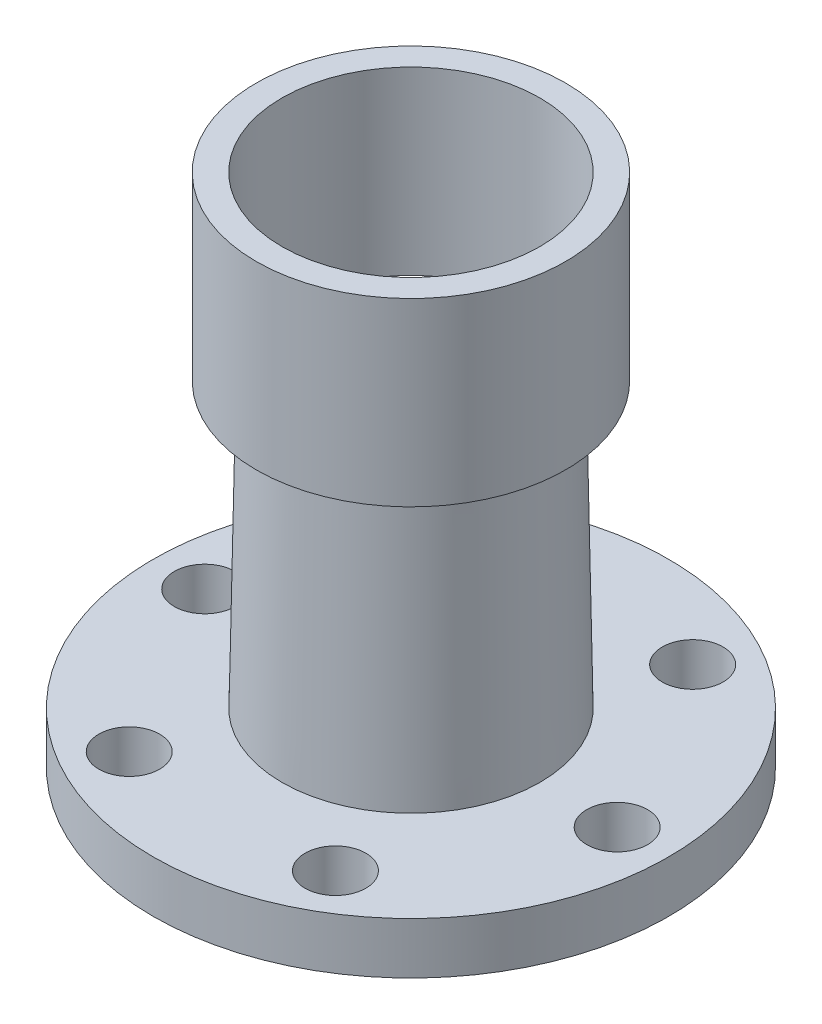
ISO-10303-21;
HEADER;
FILE_DESCRIPTION(('STEP AP214'),'2;1');
FILE_NAME('part.step','',(''),(''),'','','');
FILE_SCHEMA(('AUTOMOTIVE_DESIGN { 1 0 10303 214 1 1 1 1 }'));
ENDSEC;
DATA;
#1=APPLICATION_CONTEXT('core data for automotive mechanical design processes');
#2=APPLICATION_PROTOCOL_DEFINITION('international standard','automotive_design',2000,#1);
#3=PRODUCT_CONTEXT('',#1,'mechanical');
#4=PRODUCT('Part','Part','',(#3));
#5=PRODUCT_RELATED_PRODUCT_CATEGORY('part','',(#4));
#6=PRODUCT_DEFINITION_FORMATION('','',#4);
#7=PRODUCT_DEFINITION_CONTEXT('part definition',#1,'design');
#8=PRODUCT_DEFINITION('design','',#6,#7);
#9=PRODUCT_DEFINITION_SHAPE('','',#8);
#10=(LENGTH_UNIT() NAMED_UNIT(*) SI_UNIT(.MILLI.,.METRE.));
#11=(NAMED_UNIT(*) PLANE_ANGLE_UNIT() SI_UNIT($,.RADIAN.));
#12=(NAMED_UNIT(*) SI_UNIT($,.STERADIAN.) SOLID_ANGLE_UNIT());
#13=UNCERTAINTY_MEASURE_WITH_UNIT(LENGTH_MEASURE(1.E-05),#10,'distance_accuracy_value','');
#14=(GEOMETRIC_REPRESENTATION_CONTEXT(3) GLOBAL_UNCERTAINTY_ASSIGNED_CONTEXT((#13)) GLOBAL_UNIT_ASSIGNED_CONTEXT((#10,
#11,#12)) REPRESENTATION_CONTEXT('',''));
#15=CARTESIAN_POINT('',(0.,0.,0.));
#16=DIRECTION('',(0.,0.,1.));
#17=DIRECTION('',(1.,0.,0.));
#18=AXIS2_PLACEMENT_3D('',#15,#16,#17);
#19=CARTESIAN_POINT('',(0.,95.,0.));
#20=DIRECTION('',(0.,1.,0.));
#21=DIRECTION('',(0.,0.,1.));
#22=AXIS2_PLACEMENT_3D('',#19,#20,#21);
#23=PLANE('',#22);
#24=CARTESIAN_POINT('',(0.,95.,0.));
#25=DIRECTION('',(0.,1.,0.));
#26=DIRECTION('',(0.,0.,1.));
#27=AXIS2_PLACEMENT_3D('',#24,#25,#26);
#28=CIRCLE('',#27,30.);
#29=CARTESIAN_POINT('',(0.,95.,30.));
#30=VERTEX_POINT('',#29);
#31=EDGE_CURVE('E11',#30,#30,#28,.T.);
#32=ORIENTED_EDGE('',*,*,#31,.T.);
#33=EDGE_LOOP('',(#32));
#34=FACE_BOUND('',#33,.T.);
#35=CARTESIAN_POINT('',(0.,95.,0.));
#36=DIRECTION('',(0.,1.,0.));
#37=DIRECTION('',(0.,0.,1.));
#38=AXIS2_PLACEMENT_3D('',#35,#36,#37);
#39=CIRCLE('',#38,25.);
#40=CARTESIAN_POINT('',(0.,95.,25.));
#41=VERTEX_POINT('',#40);
#42=EDGE_CURVE('E62',#41,#41,#39,.T.);
#43=ORIENTED_EDGE('',*,*,#42,.F.);
#44=EDGE_LOOP('',(#43));
#45=FACE_BOUND('',#44,.T.);
#46=ADVANCED_FACE('F51',(#34,#45),#23,.T.);
#47=CARTESIAN_POINT('',(0.,60.,0.));
#48=DIRECTION('',(0.,1.,0.));
#49=DIRECTION('',(0.,0.,1.));
#50=AXIS2_PLACEMENT_3D('',#47,#48,#49);
#51=PLANE('',#50);
#52=CARTESIAN_POINT('',(0.,60.,0.));
#53=DIRECTION('',(0.,1.,0.));
#54=DIRECTION('',(0.,0.,1.));
#55=AXIS2_PLACEMENT_3D('',#52,#53,#54);
#56=CIRCLE('',#55,30.);
#57=CARTESIAN_POINT('',(0.,60.,30.));
#58=VERTEX_POINT('',#57);
#59=EDGE_CURVE('E55',#58,#58,#56,.T.);
#60=ORIENTED_EDGE('',*,*,#59,.F.);
#61=EDGE_LOOP('',(#60));
#62=FACE_BOUND('',#61,.T.);
#63=CARTESIAN_POINT('',(0.,60.,0.));
#64=DIRECTION('',(0.,1.,0.));
#65=DIRECTION('',(0.,0.,1.));
#66=AXIS2_PLACEMENT_3D('',#63,#64,#65);
#67=CIRCLE('',#66,25.);
#68=CARTESIAN_POINT('',(0.,60.,25.));
#69=VERTEX_POINT('',#68);
#70=EDGE_CURVE('E64',#69,#69,#67,.T.);
#71=ORIENTED_EDGE('',*,*,#70,.T.);
#72=EDGE_LOOP('',(#71));
#73=FACE_BOUND('',#72,.T.);
#74=ADVANCED_FACE('F74',(#62,#73),#51,.F.);
#75=CARTESIAN_POINT('',(0.,95.,0.));
#76=DIRECTION('',(0.,-1.,0.));
#77=DIRECTION('',(0.,0.,-1.));
#78=AXIS2_PLACEMENT_3D('',#75,#76,#77);
#79=CYLINDRICAL_SURFACE('',#78,30.);
#80=ORIENTED_EDGE('',*,*,#31,.F.);
#81=EDGE_LOOP('',(#80));
#82=FACE_BOUND('',#81,.T.);
#83=ORIENTED_EDGE('',*,*,#59,.T.);
#84=EDGE_LOOP('',(#83));
#85=FACE_BOUND('',#84,.T.);
#86=ADVANCED_FACE('F53',(#82,#85),#79,.T.);
#87=CARTESIAN_POINT('',(0.,95.,0.));
#88=DIRECTION('',(0.,-1.,0.));
#89=DIRECTION('',(0.,0.,-1.));
#90=AXIS2_PLACEMENT_3D('',#87,#88,#89);
#91=CYLINDRICAL_SURFACE('',#90,25.);
#92=ORIENTED_EDGE('',*,*,#42,.T.);
#93=EDGE_LOOP('',(#92));
#94=FACE_BOUND('',#93,.T.);
#95=ORIENTED_EDGE('',*,*,#70,.F.);
#96=EDGE_LOOP('',(#95));
#97=FACE_BOUND('',#96,.T.);
#98=ADVANCED_FACE('F70',(#94,#97),#91,.F.);
#99=CLOSED_SHELL('',(#46,#74,#86,#98));
#100=MANIFOLD_SOLID_BREP('B2',#99);
#101=CARTESIAN_POINT('',(0.,5.,0.));
#102=DIRECTION('',(0.,-1.,0.));
#103=DIRECTION('',(0.,0.,-1.));
#104=AXIS2_PLACEMENT_3D('',#101,#102,#103);
#105=CYLINDRICAL_SURFACE('',#104,50.);
#106=CARTESIAN_POINT('',(0.,5.,0.));
#107=DIRECTION('',(0.,1.,0.));
#108=DIRECTION('',(0.,0.,1.));
#109=AXIS2_PLACEMENT_3D('',#106,#107,#108);
#110=CIRCLE('',#109,50.);
#111=CARTESIAN_POINT('',(0.,5.,50.));
#112=VERTEX_POINT('',#111);
#113=EDGE_CURVE('E120',#112,#112,#110,.T.);
#114=ORIENTED_EDGE('',*,*,#113,.F.);
#115=EDGE_LOOP('',(#114));
#116=FACE_BOUND('',#115,.T.);
#117=CARTESIAN_POINT('',(0.,-5.,0.));
#118=DIRECTION('',(0.,1.,0.));
#119=DIRECTION('',(0.,0.,1.));
#120=AXIS2_PLACEMENT_3D('',#117,#118,#119);
#121=CIRCLE('',#120,50.);
#122=CARTESIAN_POINT('',(0.,-5.,50.));
#123=VERTEX_POINT('',#122);
#124=EDGE_CURVE('E125',#123,#123,#121,.T.);
#125=ORIENTED_EDGE('',*,*,#124,.T.);
#126=EDGE_LOOP('',(#125));
#127=FACE_BOUND('',#126,.T.);
#128=ADVANCED_FACE('F113',(#116,#127),#105,.T.);
#129=CARTESIAN_POINT('',(0.,5.,0.));
#130=DIRECTION('',(0.,1.,0.));
#131=DIRECTION('',(0.,0.,1.));
#132=AXIS2_PLACEMENT_3D('',#129,#130,#131);
#133=PLANE('',#132);
#134=CARTESIAN_POINT('',(20.0000000000004,5.,34.6410161513773));
#135=DIRECTION('',(0.,1.,0.));
#136=DIRECTION('',(0.,0.,1.));
#137=AXIS2_PLACEMENT_3D('',#134,#135,#136);
#138=CIRCLE('',#137,5.90000000000001);
#139=CARTESIAN_POINT('',(20.0000000000004,5.,40.5410161513773));
#140=VERTEX_POINT('',#139);
#141=EDGE_CURVE('E188',#140,#140,#138,.T.);
#142=ORIENTED_EDGE('',*,*,#141,.F.);
#143=EDGE_LOOP('',(#142));
#144=FACE_BOUND('',#143,.T.);
#145=CARTESIAN_POINT('',(-19.9999999999997,5.,34.6410161513777));
#146=DIRECTION('',(0.,1.,0.));
#147=DIRECTION('',(0.,0.,1.));
#148=AXIS2_PLACEMENT_3D('',#145,#146,#147);
#149=CIRCLE('',#148,5.90000000000001);
#150=CARTESIAN_POINT('',(-19.9999999999997,5.,40.5410161513777));
#151=VERTEX_POINT('',#150);
#152=EDGE_CURVE('E180',#151,#151,#149,.T.);
#153=ORIENTED_EDGE('',*,*,#152,.F.);
#154=EDGE_LOOP('',(#153));
#155=FACE_BOUND('',#154,.T.);
#156=CARTESIAN_POINT('',(-40.,5.,0.));
#157=DIRECTION('',(0.,1.,0.));
#158=DIRECTION('',(0.,0.,1.));
#159=AXIS2_PLACEMENT_3D('',#156,#157,#158);
#160=CIRCLE('',#159,5.90000000000002);
#161=CARTESIAN_POINT('',(-40.,5.,5.90000000000002));
#162=VERTEX_POINT('',#161);
#163=EDGE_CURVE('E172',#162,#162,#160,.T.);
#164=ORIENTED_EDGE('',*,*,#163,.F.);
#165=EDGE_LOOP('',(#164));
#166=FACE_BOUND('',#165,.T.);
#167=CARTESIAN_POINT('',(-20.0000000000002,5.,-34.6410161513775));
#168=DIRECTION('',(0.,1.,0.));
#169=DIRECTION('',(0.,0.,1.));
#170=AXIS2_PLACEMENT_3D('',#167,#168,#169);
#171=CIRCLE('',#170,5.90000000000001);
#172=CARTESIAN_POINT('',(-20.0000000000002,5.,-28.7410161513775));
#173=VERTEX_POINT('',#172);
#174=EDGE_CURVE('E164',#173,#173,#171,.T.);
#175=ORIENTED_EDGE('',*,*,#174,.F.);
#176=EDGE_LOOP('',(#175));
#177=FACE_BOUND('',#176,.T.);
#178=CARTESIAN_POINT('',(19.9999999999999,5.,-34.6410161513776));
#179=DIRECTION('',(0.,1.,0.));
#180=DIRECTION('',(0.,0.,1.));
#181=AXIS2_PLACEMENT_3D('',#178,#179,#180);
#182=CIRCLE('',#181,5.90000000000001);
#183=CARTESIAN_POINT('',(19.9999999999999,5.,-28.7410161513776));
#184=VERTEX_POINT('',#183);
#185=EDGE_CURVE('E156',#184,#184,#182,.T.);
#186=ORIENTED_EDGE('',*,*,#185,.F.);
#187=EDGE_LOOP('',(#186));
#188=FACE_BOUND('',#187,.T.);
#189=CARTESIAN_POINT('',(40.,5.,0.));
#190=DIRECTION('',(0.,1.,0.));
#191=DIRECTION('',(0.,0.,1.));
#192=AXIS2_PLACEMENT_3D('',#189,#190,#191);
#193=CIRCLE('',#192,5.90000000000002);
#194=CARTESIAN_POINT('',(40.,5.,5.90000000000002));
#195=VERTEX_POINT('',#194);
#196=EDGE_CURVE('E148',#195,#195,#193,.T.);
#197=ORIENTED_EDGE('',*,*,#196,.F.);
#198=EDGE_LOOP('',(#197));
#199=FACE_BOUND('',#198,.T.);
#200=CARTESIAN_POINT('',(0.,5.,0.));
#201=DIRECTION('',(0.,1.,0.));
#202=DIRECTION('',(0.,0.,1.));
#203=AXIS2_PLACEMENT_3D('',#200,#201,#202);
#204=CIRCLE('',#203,25.);
#205=CARTESIAN_POINT('',(0.,5.,25.));
#206=VERTEX_POINT('',#205);
#207=EDGE_CURVE('E137',#206,#206,#204,.T.);
#208=ORIENTED_EDGE('',*,*,#207,.F.);
#209=EDGE_LOOP('',(#208));
#210=FACE_BOUND('',#209,.T.);
#211=ORIENTED_EDGE('',*,*,#113,.T.);
#212=EDGE_LOOP('',(#211));
#213=FACE_BOUND('',#212,.T.);
#214=ADVANCED_FACE('F195',(#144,#155,#166,#177,#188,#199,#210,#213),#133,.T.);
#215=CARTESIAN_POINT('',(0.,-5.,0.));
#216=DIRECTION('',(0.,1.,0.));
#217=DIRECTION('',(0.,0.,1.));
#218=AXIS2_PLACEMENT_3D('',#215,#216,#217);
#219=PLANE('',#218);
#220=CARTESIAN_POINT('',(20.0000000000004,-5.,34.6410161513773));
#221=DIRECTION('',(0.,1.,0.));
#222=DIRECTION('',(0.,0.,1.));
#223=AXIS2_PLACEMENT_3D('',#220,#221,#222);
#224=CIRCLE('',#223,5.90000000000001);
#225=CARTESIAN_POINT('',(20.0000000000004,-5.,40.5410161513773));
#226=VERTEX_POINT('',#225);
#227=EDGE_CURVE('E184',#226,#226,#224,.T.);
#228=ORIENTED_EDGE('',*,*,#227,.T.);
#229=EDGE_LOOP('',(#228));
#230=FACE_BOUND('',#229,.T.);
#231=CARTESIAN_POINT('',(-19.9999999999997,-5.,34.6410161513777));
#232=DIRECTION('',(0.,1.,0.));
#233=DIRECTION('',(0.,0.,1.));
#234=AXIS2_PLACEMENT_3D('',#231,#232,#233);
#235=CIRCLE('',#234,5.90000000000001);
#236=CARTESIAN_POINT('',(-19.9999999999997,-5.,40.5410161513777));
#237=VERTEX_POINT('',#236);
#238=EDGE_CURVE('E176',#237,#237,#235,.T.);
#239=ORIENTED_EDGE('',*,*,#238,.T.);
#240=EDGE_LOOP('',(#239));
#241=FACE_BOUND('',#240,.T.);
#242=CARTESIAN_POINT('',(-40.,-5.,0.));
#243=DIRECTION('',(0.,1.,0.));
#244=DIRECTION('',(0.,0.,1.));
#245=AXIS2_PLACEMENT_3D('',#242,#243,#244);
#246=CIRCLE('',#245,5.90000000000001);
#247=CARTESIAN_POINT('',(-40.,-5.,5.90000000000001));
#248=VERTEX_POINT('',#247);
#249=EDGE_CURVE('E168',#248,#248,#246,.T.);
#250=ORIENTED_EDGE('',*,*,#249,.T.);
#251=EDGE_LOOP('',(#250));
#252=FACE_BOUND('',#251,.T.);
#253=CARTESIAN_POINT('',(-20.0000000000002,-5.,-34.6410161513775));
#254=DIRECTION('',(0.,1.,0.));
#255=DIRECTION('',(0.,0.,1.));
#256=AXIS2_PLACEMENT_3D('',#253,#254,#255);
#257=CIRCLE('',#256,5.90000000000001);
#258=CARTESIAN_POINT('',(-20.0000000000002,-5.,-28.7410161513775));
#259=VERTEX_POINT('',#258);
#260=EDGE_CURVE('E160',#259,#259,#257,.T.);
#261=ORIENTED_EDGE('',*,*,#260,.T.);
#262=EDGE_LOOP('',(#261));
#263=FACE_BOUND('',#262,.T.);
#264=CARTESIAN_POINT('',(19.9999999999999,-5.,-34.6410161513776));
#265=DIRECTION('',(0.,1.,0.));
#266=DIRECTION('',(0.,0.,1.));
#267=AXIS2_PLACEMENT_3D('',#264,#265,#266);
#268=CIRCLE('',#267,5.90000000000001);
#269=CARTESIAN_POINT('',(19.9999999999999,-5.,-28.7410161513776));
#270=VERTEX_POINT('',#269);
#271=EDGE_CURVE('E152',#270,#270,#268,.T.);
#272=ORIENTED_EDGE('',*,*,#271,.T.);
#273=EDGE_LOOP('',(#272));
#274=FACE_BOUND('',#273,.T.);
#275=CARTESIAN_POINT('',(40.,-5.,0.));
#276=DIRECTION('',(0.,1.,0.));
#277=DIRECTION('',(0.,0.,1.));
#278=AXIS2_PLACEMENT_3D('',#275,#276,#277);
#279=CIRCLE('',#278,5.90000000000001);
#280=CARTESIAN_POINT('',(40.,-5.,5.90000000000001));
#281=VERTEX_POINT('',#280);
#282=EDGE_CURVE('E138',#281,#281,#279,.T.);
#283=ORIENTED_EDGE('',*,*,#282,.T.);
#284=EDGE_LOOP('',(#283));
#285=FACE_BOUND('',#284,.T.);
#286=ORIENTED_EDGE('',*,*,#124,.F.);
#287=EDGE_LOOP('',(#286));
#288=FACE_BOUND('',#287,.T.);
#289=ADVANCED_FACE('F198',(#230,#241,#252,#263,#274,#285,#288),#219,.F.);
#290=CARTESIAN_POINT('',(0.,60.,0.));
#291=DIRECTION('',(0.,1.,0.));
#292=DIRECTION('',(0.,0.,1.));
#293=AXIS2_PLACEMENT_3D('',#290,#291,#292);
#294=PLANE('',#293);
#295=CARTESIAN_POINT('',(0.,60.,0.));
#296=DIRECTION('',(0.,1.,0.));
#297=DIRECTION('',(0.,0.,1.));
#298=AXIS2_PLACEMENT_3D('',#295,#296,#297);
#299=CIRCLE('',#298,24.039971428948);
#300=CARTESIAN_POINT('',(0.,60.,24.039971428948));
#301=VERTEX_POINT('',#300);
#302=EDGE_CURVE('E131',#301,#301,#299,.T.);
#303=ORIENTED_EDGE('',*,*,#302,.T.);
#304=EDGE_LOOP('',(#303));
#305=FACE_BOUND('',#304,.T.);
#306=CARTESIAN_POINT('',(0.,60.,0.));
#307=DIRECTION('',(0.,1.,0.));
#308=DIRECTION('',(0.,0.,1.));
#309=AXIS2_PLACEMENT_3D('',#306,#307,#308);
#310=CIRCLE('',#309,20.960028571052);
#311=CARTESIAN_POINT('',(0.,60.,20.960028571052));
#312=VERTEX_POINT('',#311);
#313=EDGE_CURVE('E133',#312,#312,#310,.T.);
#314=ORIENTED_EDGE('',*,*,#313,.F.);
#315=EDGE_LOOP('',(#314));
#316=FACE_BOUND('',#315,.T.);
#317=ADVANCED_FACE('F216',(#305,#316),#294,.T.);
#318=CARTESIAN_POINT('',(0.,5.,0.));
#319=DIRECTION('',(0.,-1.,0.));
#320=DIRECTION('',(0.,0.,1.));
#321=AXIS2_PLACEMENT_3D('',#318,#319,#320);
#322=CONICAL_SURFACE('',#321,25.,0.0174532925199433);
#323=ORIENTED_EDGE('',*,*,#302,.F.);
#324=EDGE_LOOP('',(#323));
#325=FACE_BOUND('',#324,.T.);
#326=ORIENTED_EDGE('',*,*,#207,.T.);
#327=EDGE_LOOP('',(#326));
#328=FACE_BOUND('',#327,.T.);
#329=ADVANCED_FACE('F213',(#325,#328),#322,.T.);
#330=CARTESIAN_POINT('',(0.,5.,0.));
#331=DIRECTION('',(0.,1.,0.));
#332=DIRECTION('',(0.,0.,1.));
#333=AXIS2_PLACEMENT_3D('',#330,#331,#332);
#334=CONICAL_SURFACE('',#333,20.,0.0174532925199433);
#335=ORIENTED_EDGE('',*,*,#313,.T.);
#336=EDGE_LOOP('',(#335));
#337=FACE_BOUND('',#336,.T.);
#338=CARTESIAN_POINT('',(0.,5.,0.));
#339=DIRECTION('',(0.,1.,0.));
#340=DIRECTION('',(0.,0.,1.));
#341=AXIS2_PLACEMENT_3D('',#338,#339,#340);
#342=CIRCLE('',#341,20.);
#343=CARTESIAN_POINT('',(0.,5.,20.));
#344=VERTEX_POINT('',#343);
#345=EDGE_CURVE('E50',#344,#344,#342,.F.);
#346=ORIENTED_EDGE('',*,*,#345,.T.);
#347=EDGE_LOOP('',(#346));
#348=FACE_BOUND('',#347,.T.);
#349=ADVANCED_FACE('F215',(#337,#348),#334,.F.);
#350=ORIENTED_EDGE('',*,*,#345,.F.);
#351=EDGE_LOOP('',(#350));
#352=FACE_BOUND('',#351,.T.);
#353=ADVANCED_FACE('F200',(#352),#133,.T.);
#354=CARTESIAN_POINT('',(40.,5.,0.));
#355=DIRECTION('',(0.,1.,0.));
#356=DIRECTION('',(0.,0.,1.));
#357=AXIS2_PLACEMENT_3D('',#354,#355,#356);
#358=CYLINDRICAL_SURFACE('',#357,5.90000000000001);
#359=ORIENTED_EDGE('',*,*,#282,.F.);
#360=EDGE_LOOP('',(#359));
#361=FACE_BOUND('',#360,.T.);
#362=ORIENTED_EDGE('',*,*,#196,.T.);
#363=EDGE_LOOP('',(#362));
#364=FACE_BOUND('',#363,.T.);
#365=ADVANCED_FACE('F252',(#361,#364),#358,.F.);
#366=CARTESIAN_POINT('',(19.9999999999999,5.,-34.6410161513776));
#367=DIRECTION('',(0.,1.,0.));
#368=DIRECTION('',(0.,0.,1.));
#369=AXIS2_PLACEMENT_3D('',#366,#367,#368);
#370=CYLINDRICAL_SURFACE('',#369,5.90000000000001);
#371=ORIENTED_EDGE('',*,*,#271,.F.);
#372=EDGE_LOOP('',(#371));
#373=FACE_BOUND('',#372,.T.);
#374=ORIENTED_EDGE('',*,*,#185,.T.);
#375=EDGE_LOOP('',(#374));
#376=FACE_BOUND('',#375,.T.);
#377=ADVANCED_FACE('F255',(#373,#376),#370,.F.);
#378=CARTESIAN_POINT('',(-20.0000000000002,5.,-34.6410161513775));
#379=DIRECTION('',(0.,1.,0.));
#380=DIRECTION('',(0.,0.,1.));
#381=AXIS2_PLACEMENT_3D('',#378,#379,#380);
#382=CYLINDRICAL_SURFACE('',#381,5.90000000000001);
#383=ORIENTED_EDGE('',*,*,#260,.F.);
#384=EDGE_LOOP('',(#383));
#385=FACE_BOUND('',#384,.T.);
#386=ORIENTED_EDGE('',*,*,#174,.T.);
#387=EDGE_LOOP('',(#386));
#388=FACE_BOUND('',#387,.T.);
#389=ADVANCED_FACE('F260',(#385,#388),#382,.F.);
#390=CARTESIAN_POINT('',(-40.,5.,0.));
#391=DIRECTION('',(0.,1.,0.));
#392=DIRECTION('',(0.,0.,1.));
#393=AXIS2_PLACEMENT_3D('',#390,#391,#392);
#394=CYLINDRICAL_SURFACE('',#393,5.90000000000001);
#395=ORIENTED_EDGE('',*,*,#249,.F.);
#396=EDGE_LOOP('',(#395));
#397=FACE_BOUND('',#396,.T.);
#398=ORIENTED_EDGE('',*,*,#163,.T.);
#399=EDGE_LOOP('',(#398));
#400=FACE_BOUND('',#399,.T.);
#401=ADVANCED_FACE('F267',(#397,#400),#394,.F.);
#402=CARTESIAN_POINT('',(-19.9999999999997,5.,34.6410161513777));
#403=DIRECTION('',(0.,1.,0.));
#404=DIRECTION('',(0.,0.,1.));
#405=AXIS2_PLACEMENT_3D('',#402,#403,#404);
#406=CYLINDRICAL_SURFACE('',#405,5.90000000000001);
#407=ORIENTED_EDGE('',*,*,#238,.F.);
#408=EDGE_LOOP('',(#407));
#409=FACE_BOUND('',#408,.T.);
#410=ORIENTED_EDGE('',*,*,#152,.T.);
#411=EDGE_LOOP('',(#410));
#412=FACE_BOUND('',#411,.T.);
#413=ADVANCED_FACE('F271',(#409,#412),#406,.F.);
#414=CARTESIAN_POINT('',(20.0000000000004,5.,34.6410161513773));
#415=DIRECTION('',(0.,1.,0.));
#416=DIRECTION('',(0.,0.,1.));
#417=AXIS2_PLACEMENT_3D('',#414,#415,#416);
#418=CYLINDRICAL_SURFACE('',#417,5.90000000000001);
#419=ORIENTED_EDGE('',*,*,#227,.F.);
#420=EDGE_LOOP('',(#419));
#421=FACE_BOUND('',#420,.T.);
#422=ORIENTED_EDGE('',*,*,#141,.T.);
#423=EDGE_LOOP('',(#422));
#424=FACE_BOUND('',#423,.T.);
#425=ADVANCED_FACE('F193',(#421,#424),#418,.F.);
#426=CLOSED_SHELL('',(#128,#214,#289,#317,#329,#349,#353,#365,#377,#389,#401,#413,#425));
#427=MANIFOLD_SOLID_BREP('B6',#426);
#428=ADVANCED_BREP_SHAPE_REPRESENTATION('',(#18,#100,#427),#14);
#429=SHAPE_DEFINITION_REPRESENTATION(#9,#428);
ENDSEC;
END-ISO-10303-21;
